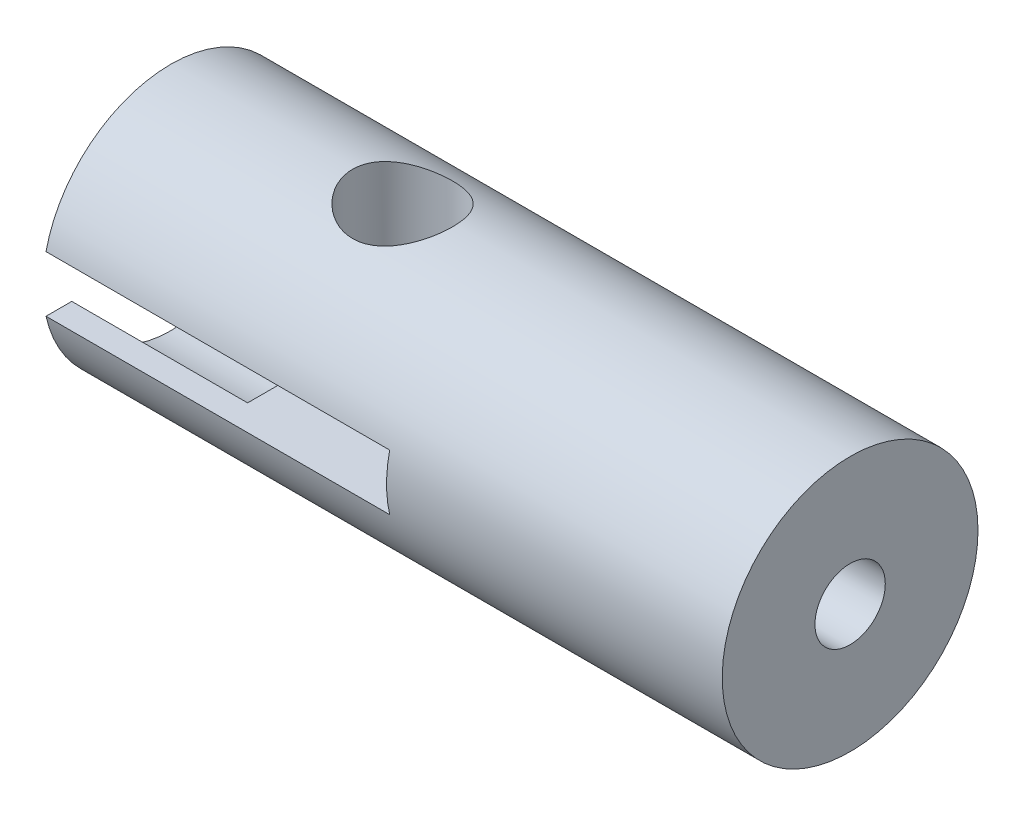
ISO-10303-21;
HEADER;
FILE_DESCRIPTION(('STEP AP214'),'2;1');
FILE_NAME('part.step','',(''),(''),'','','');
FILE_SCHEMA(('AUTOMOTIVE_DESIGN { 1 0 10303 214 1 1 1 1 }'));
ENDSEC;
DATA;
#1=APPLICATION_CONTEXT('core data for automotive mechanical design processes');
#2=APPLICATION_PROTOCOL_DEFINITION('international standard','automotive_design',2000,#1);
#3=PRODUCT_CONTEXT('',#1,'mechanical');
#4=PRODUCT('Part','Part','',(#3));
#5=PRODUCT_RELATED_PRODUCT_CATEGORY('part','',(#4));
#6=PRODUCT_DEFINITION_FORMATION('','',#4);
#7=PRODUCT_DEFINITION_CONTEXT('part definition',#1,'design');
#8=PRODUCT_DEFINITION('design','',#6,#7);
#9=PRODUCT_DEFINITION_SHAPE('','',#8);
#10=(LENGTH_UNIT() NAMED_UNIT(*) SI_UNIT(.MILLI.,.METRE.));
#11=(NAMED_UNIT(*) PLANE_ANGLE_UNIT() SI_UNIT($,.RADIAN.));
#12=(NAMED_UNIT(*) SI_UNIT($,.STERADIAN.) SOLID_ANGLE_UNIT());
#13=UNCERTAINTY_MEASURE_WITH_UNIT(LENGTH_MEASURE(1.E-05),#10,'distance_accuracy_value','');
#14=(GEOMETRIC_REPRESENTATION_CONTEXT(3) GLOBAL_UNCERTAINTY_ASSIGNED_CONTEXT((#13)) GLOBAL_UNIT_ASSIGNED_CONTEXT((#10,
#11,#12)) REPRESENTATION_CONTEXT('',''));
#15=CARTESIAN_POINT('',(0.,0.,0.));
#16=DIRECTION('',(0.,0.,1.));
#17=DIRECTION('',(1.,0.,0.));
#18=AXIS2_PLACEMENT_3D('',#15,#16,#17);
#19=CARTESIAN_POINT('',(-60.5,0.,0.));
#20=DIRECTION('',(-1.,0.,0.));
#21=DIRECTION('',(0.,0.,1.));
#22=AXIS2_PLACEMENT_3D('',#19,#20,#21);
#23=CYLINDRICAL_SURFACE('',#22,12.875);
#24=CARTESIAN_POINT('',(-60.5,0.,0.));
#25=DIRECTION('',(-1.,0.,0.));
#26=DIRECTION('',(0.,0.,1.));
#27=AXIS2_PLACEMENT_3D('',#24,#25,#26);
#28=CIRCLE('',#27,12.875);
#29=CARTESIAN_POINT('',(-60.5,3.5,12.3901422509994));
#30=VERTEX_POINT('',#29);
#31=CARTESIAN_POINT('',(-60.5,3.5,-12.3901422509994));
#32=VERTEX_POINT('',#31);
#33=EDGE_CURVE('E124',#30,#32,#28,.T.);
#34=ORIENTED_EDGE('',*,*,#33,.F.);
#35=DIRECTION('',(-1.,0.,0.));
#36=VECTOR('',#35,1.);
#37=CARTESIAN_POINT('',(-60.5,3.5,12.3901422509994));
#38=LINE('',#37,#36);
#39=CARTESIAN_POINT('',(-82.5,3.5,12.3901422509994));
#40=VERTEX_POINT('',#39);
#41=EDGE_CURVE('E61',#40,#30,#38,.F.);
#42=ORIENTED_EDGE('',*,*,#41,.F.);
#43=CARTESIAN_POINT('',(-82.5,0.,0.));
#44=DIRECTION('',(-1.,0.,0.));
#45=DIRECTION('',(0.,0.,1.));
#46=AXIS2_PLACEMENT_3D('',#43,#44,#45);
#47=CIRCLE('',#46,12.875);
#48=CARTESIAN_POINT('',(-82.5,3.5,-12.3901422509994));
#49=VERTEX_POINT('',#48);
#50=EDGE_CURVE('E128',#40,#49,#47,.T.);
#51=ORIENTED_EDGE('',*,*,#50,.T.);
#52=DIRECTION('',(-1.,0.,0.));
#53=VECTOR('',#52,1.);
#54=CARTESIAN_POINT('',(-60.5,3.5,-12.3901422509994));
#55=LINE('',#54,#53);
#56=EDGE_CURVE('E131',#32,#49,#55,.T.);
#57=ORIENTED_EDGE('',*,*,#56,.F.);
#58=EDGE_LOOP('',(#34,#42,#51,#57));
#59=FACE_BOUND('',#58,.T.);
#60=ADVANCED_FACE('F37',(#59),#23,.F.);
#61=CARTESIAN_POINT('',(-60.5,0.,0.));
#62=DIRECTION('',(-1.,0.,0.));
#63=DIRECTION('',(0.,0.,1.));
#64=AXIS2_PLACEMENT_3D('',#61,#62,#63);
#65=PLANE('',#64);
#66=DIRECTION('',(0.,0.,1.));
#67=VECTOR('',#66,1.);
#68=CARTESIAN_POINT('',(-60.5,3.5,-25.));
#69=LINE('',#68,#67);
#70=EDGE_CURVE('E11',#32,#30,#69,.T.);
#71=ORIENTED_EDGE('',*,*,#70,.T.);
#72=ORIENTED_EDGE('',*,*,#33,.T.);
#73=EDGE_LOOP('',(#71,#72));
#74=FACE_BOUND('',#73,.T.);
#75=ADVANCED_FACE('F212',(#74),#65,.T.);
#76=CARTESIAN_POINT('',(-60.5,-3.5,-12.3901422509994));
#77=VERTEX_POINT('',#76);
#78=CARTESIAN_POINT('',(-60.5,-3.5,12.3901422509994));
#79=VERTEX_POINT('',#78);
#80=EDGE_CURVE('E127',#77,#79,#28,.T.);
#81=ORIENTED_EDGE('',*,*,#80,.F.);
#82=DIRECTION('',(-1.,0.,0.));
#83=VECTOR('',#82,1.);
#84=CARTESIAN_POINT('',(-60.5,-3.5,-12.3901422509994));
#85=LINE('',#84,#83);
#86=CARTESIAN_POINT('',(-82.5,-3.5,-12.3901422509994));
#87=VERTEX_POINT('',#86);
#88=EDGE_CURVE('E53',#87,#77,#85,.F.);
#89=ORIENTED_EDGE('',*,*,#88,.F.);
#90=CARTESIAN_POINT('',(-82.5,-3.5,12.3901422509994));
#91=VERTEX_POINT('',#90);
#92=EDGE_CURVE('E119',#87,#91,#47,.T.);
#93=ORIENTED_EDGE('',*,*,#92,.T.);
#94=DIRECTION('',(-1.,0.,0.));
#95=VECTOR('',#94,1.);
#96=CARTESIAN_POINT('',(-60.5,-3.5,12.3901422509994));
#97=LINE('',#96,#95);
#98=EDGE_CURVE('E135',#79,#91,#97,.T.);
#99=ORIENTED_EDGE('',*,*,#98,.F.);
#100=EDGE_LOOP('',(#81,#89,#93,#99));
#101=FACE_BOUND('',#100,.T.);
#102=ADVANCED_FACE('F209',(#101),#23,.F.);
#103=DIRECTION('',(0.,0.,-1.));
#104=VECTOR('',#103,1.);
#105=CARTESIAN_POINT('',(-60.5,-3.5,-25.));
#106=LINE('',#105,#104);
#107=EDGE_CURVE('E138',#79,#77,#106,.T.);
#108=ORIENTED_EDGE('',*,*,#107,.T.);
#109=ORIENTED_EDGE('',*,*,#80,.T.);
#110=EDGE_LOOP('',(#108,#109));
#111=FACE_BOUND('',#110,.T.);
#112=ADVANCED_FACE('F186',(#111),#65,.T.);
#113=CARTESIAN_POINT('',(-53.5,-16.,0.));
#114=DIRECTION('',(0.,1.,0.));
#115=DIRECTION('',(0.,0.,1.));
#116=AXIS2_PLACEMENT_3D('',#113,#114,#115);
#117=CYLINDRICAL_SURFACE('',#116,6.25);
#118=CARTESIAN_POINT('',(-53.5,3.5,0.));
#119=DIRECTION('',(0.,1.,0.));
#120=DIRECTION('',(0.,0.,1.));
#121=AXIS2_PLACEMENT_3D('',#118,#119,#120);
#122=CIRCLE('',#121,6.25);
#123=CARTESIAN_POINT('',(-53.5,3.5,6.25));
#124=VERTEX_POINT('',#123);
#125=EDGE_CURVE('E159',#124,#124,#122,.F.);
#126=ORIENTED_EDGE('',*,*,#125,.T.);
#127=EDGE_LOOP('',(#126));
#128=FACE_BOUND('',#127,.T.);
#129=CARTESIAN_POINT('',(-53.5,14.7287983216554,6.25));
#130=CARTESIAN_POINT('',(-53.3318745618639,14.7287971924459,6.25000119533584));
#131=CARTESIAN_POINT('',(-53.1637644094569,14.7316846285478,6.24321077356855));
#132=CARTESIAN_POINT('',(-52.8287699924416,14.7431349119434,6.21612360142927));
#133=CARTESIAN_POINT('',(-52.6618861451846,14.7516996084594,6.19582245027452));
#134=CARTESIAN_POINT('',(-52.3307382243454,14.7742137038016,6.14194246405766));
#135=CARTESIAN_POINT('',(-52.1664728822091,14.7881604072821,6.10837027501717));
#136=CARTESIAN_POINT('',(-51.8415707475052,14.8209902546626,6.02827658824581));
#137=CARTESIAN_POINT('',(-51.6809354225531,14.8398753576926,5.98174995083399));
#138=CARTESIAN_POINT('',(-51.3649014489429,14.8819248209711,5.87635251938849));
#139=CARTESIAN_POINT('',(-51.2094884054807,14.905076039161,5.81751956256758));
#140=CARTESIAN_POINT('',(-50.9042729613511,14.9550198745527,5.68789968338292));
#141=CARTESIAN_POINT('',(-50.7544727174836,14.9818138736069,5.61710822219746));
#142=CARTESIAN_POINT('',(-50.4614009820522,15.0382813477027,5.46413191331458));
#143=CARTESIAN_POINT('',(-50.3181288187733,15.0679545254998,5.38194824136649));
#144=CARTESIAN_POINT('',(-50.0388029903374,15.1294022294292,5.20670818975228));
#145=CARTESIAN_POINT('',(-49.9027519687505,15.1611775156838,5.1136478676598));
#146=CARTESIAN_POINT('',(-49.6321380254842,15.2276004759719,4.91242801128222));
#147=CARTESIAN_POINT('',(-49.4979746687822,15.262312604714,4.80375205763725));
#148=CARTESIAN_POINT('',(-49.2391584040224,15.3322125567923,4.57574846976622));
#149=CARTESIAN_POINT('',(-49.1145057548808,15.3674003930483,4.45642054574644));
#150=CARTESIAN_POINT('',(-48.8753798527518,15.4373421212045,4.2077492725668));
#151=CARTESIAN_POINT('',(-48.7609107634521,15.4720958306594,4.07840186687151));
#152=CARTESIAN_POINT('',(-48.5429502906426,15.5402422053392,3.81050740786865));
#153=CARTESIAN_POINT('',(-48.439455119296,15.5736353377242,3.67196355589811));
#154=CARTESIAN_POINT('',(-48.2403856809305,15.6394336156898,3.38100438317759));
#155=CARTESIAN_POINT('',(-48.1452597287548,15.6717534728587,3.22826245706032));
#156=CARTESIAN_POINT('',(-47.9683220901263,15.733088523492,2.91469279196623));
#157=CARTESIAN_POINT('',(-47.8865053537589,15.7621049691093,2.75386815027409));
#158=CARTESIAN_POINT('',(-47.7368738441382,15.8160124685616,2.42517607917603));
#159=CARTESIAN_POINT('',(-47.6690578463735,15.8409038831362,2.25730926722822));
#160=CARTESIAN_POINT('',(-47.548088778838,15.8858298543968,1.91574313465942));
#161=CARTESIAN_POINT('',(-47.4949348204946,15.9058647053994,1.74204416820412));
#162=CARTESIAN_POINT('',(-47.4059698647278,15.9396703581524,1.39833215756739));
#163=CARTESIAN_POINT('',(-47.3694686751664,15.9536886481305,1.22852197047278));
#164=CARTESIAN_POINT('',(-47.3106958548009,15.9763653137595,0.886106600176588));
#165=CARTESIAN_POINT('',(-47.2884234252342,15.9850239902833,0.713501574427272));
#166=CARTESIAN_POINT('',(-47.2583543878455,15.9967324161831,0.366895188844011));
#167=CARTESIAN_POINT('',(-47.2505536258713,15.9997837751605,0.192894244122676));
#168=CARTESIAN_POINT('',(-47.2495033425681,16.0001939715869,-0.155155564748422));
#169=CARTESIAN_POINT('',(-47.2562533374494,15.9975529982969,-0.329204427112618));
#170=CARTESIAN_POINT('',(-47.2834718497347,15.9869502406408,-0.666606217184623));
#171=CARTESIAN_POINT('',(-47.3031818162713,15.9792827313525,-0.830030279377261));
#172=CARTESIAN_POINT('',(-47.3553706163634,15.9591162275498,-1.1545784841537));
#173=CARTESIAN_POINT('',(-47.3878536262772,15.9466156528069,-1.31570185661419));
#174=CARTESIAN_POINT('',(-47.4652690847394,15.9171039649937,-1.6344459582593));
#175=CARTESIAN_POINT('',(-47.5101974672622,15.9000943251573,-1.79206781328725));
#176=CARTESIAN_POINT('',(-47.6121280329063,15.8619766325906,-2.1029095269661));
#177=CARTESIAN_POINT('',(-47.6691347982544,15.8408670246922,-2.25612768984602));
#178=CARTESIAN_POINT('',(-47.7956549780754,15.7947311870257,-2.55936093773527));
#179=CARTESIAN_POINT('',(-47.8653378905597,15.7696525627424,-2.70929726725614));
#180=CARTESIAN_POINT('',(-48.0161219315472,15.7164068237308,-3.00280079887725));
#181=CARTESIAN_POINT('',(-48.0972269466675,15.688238658444,-3.14636581103952));
#182=CARTESIAN_POINT('',(-48.2702748285916,15.6294882466814,-3.42630347184926));
#183=CARTESIAN_POINT('',(-48.3622187339248,15.5989057689709,-3.56267542947841));
#184=CARTESIAN_POINT('',(-48.5563534130119,15.5360454524047,-3.82750808947369));
#185=CARTESIAN_POINT('',(-48.6585447018986,15.5037675283582,-3.95596839359897));
#186=CARTESIAN_POINT('',(-48.8793426252672,15.436199100305,-4.21217281456284));
#187=CARTESIAN_POINT('',(-48.9985784247572,15.4008470940386,-4.3393590913189));
#188=CARTESIAN_POINT('',(-49.2471921944997,15.3300255269734,-4.58327885666985));
#189=CARTESIAN_POINT('',(-49.3765671612275,15.2945560039461,-4.70001541899611));
#190=CARTESIAN_POINT('',(-49.6448347130335,15.2244221583151,-4.92245681845124));
#191=CARTESIAN_POINT('',(-49.783733512758,15.1897583816257,-5.02815433650731));
#192=CARTESIAN_POINT('',(-50.0701274531326,15.1222409435636,-5.22770725137747));
#193=CARTESIAN_POINT('',(-50.21761922714,15.0893865829639,-5.32156724100855));
#194=CARTESIAN_POINT('',(-50.5243956767149,15.0255990986937,-5.49913715656384));
#195=CARTESIAN_POINT('',(-50.6838887964774,14.9947395094755,-5.58251405280771));
#196=CARTESIAN_POINT('',(-51.0099974920596,14.9369300515934,-5.73539906260939));
#197=CARTESIAN_POINT('',(-51.1766101591858,14.9099786056591,-5.80491277542402));
#198=CARTESIAN_POINT('',(-51.515814489309,14.8608998731869,-5.92942975388384));
#199=CARTESIAN_POINT('',(-51.6884044100543,14.8387711943965,-5.98443720820987));
#200=CARTESIAN_POINT('',(-52.0382961407722,14.8001304263756,-6.07937275038553));
#201=CARTESIAN_POINT('',(-52.2155975918656,14.7836179106744,-6.1193019832452));
#202=CARTESIAN_POINT('',(-52.5629172448223,14.7576225255591,-6.18171902842603));
#203=CARTESIAN_POINT('',(-52.7327493648813,14.7477829068698,-6.20509558869646));
#204=CARTESIAN_POINT('',(-53.0739939719087,14.7339718150404,-6.23781960575043));
#205=CARTESIAN_POINT('',(-53.2454063710524,14.7300000177477,-6.24716783749283));
#206=CARTESIAN_POINT('',(-53.5884110138535,14.7280653746149,-6.25172744727001));
#207=CARTESIAN_POINT('',(-53.7600032047611,14.7301010934176,-6.24694220217217));
#208=CARTESIAN_POINT('',(-54.1020372421356,14.7401061290878,-6.22329782230177));
#209=CARTESIAN_POINT('',(-54.272479114832,14.7480753101966,-6.20443900953508));
#210=CARTESIAN_POINT('',(-54.601818271393,14.7690876694987,-6.15424589823815));
#211=CARTESIAN_POINT('',(-54.7608451740568,14.7818364290921,-6.12363338356863));
#212=CARTESIAN_POINT('',(-55.0756753621039,14.812011728143,-6.05027935024995));
#213=CARTESIAN_POINT('',(-55.2314775825362,14.8294397872034,-6.00753389116814));
#214=CARTESIAN_POINT('',(-55.5388003522171,14.8684556909174,-5.91031005379117));
#215=CARTESIAN_POINT('',(-55.6903217491635,14.8900427052912,-5.85583401709418));
#216=CARTESIAN_POINT('',(-55.9882967357882,14.9367819819445,-5.73556490959853));
#217=CARTESIAN_POINT('',(-56.1347483579379,14.9619356095129,-5.6697675029449));
#218=CARTESIAN_POINT('',(-56.4273506365049,15.0161716469541,-5.52456561486722));
#219=CARTESIAN_POINT('',(-56.5732659268083,15.045369167268,-5.44472990345579));
#220=CARTESIAN_POINT('',(-56.8579694376977,15.106094948254,-5.27390861508804));
#221=CARTESIAN_POINT('',(-56.9967551913994,15.1376240065759,-5.18291921524108));
#222=CARTESIAN_POINT('',(-57.2664523500769,15.2021878548894,-4.99037013531658));
#223=CARTESIAN_POINT('',(-57.3973624112562,15.2352229001604,-4.88880865939604));
#224=CARTESIAN_POINT('',(-57.6506150287129,15.3019665722728,-4.67571219247741));
#225=CARTESIAN_POINT('',(-57.7729572707327,15.3356752237631,-4.56417683599034));
#226=CARTESIAN_POINT('',(-58.0166919985611,15.4053051023049,-4.32357877630552));
#227=CARTESIAN_POINT('',(-58.1374168094849,15.4412157993073,-4.19383550178136));
#228=CARTESIAN_POINT('',(-58.3675179615194,15.511874272651,-3.92442878325374));
#229=CARTESIAN_POINT('',(-58.4768979240944,15.546622417684,-3.78476852904577));
#230=CARTESIAN_POINT('',(-58.6836521192253,15.6140383130864,-3.49624945077588));
#231=CARTESIAN_POINT('',(-58.7810209745282,15.6467051285239,-3.34738655122766));
#232=CARTESIAN_POINT('',(-58.9629165970195,15.7090311017528,-3.04149484272905));
#233=CARTESIAN_POINT('',(-59.0474488711937,15.738691547472,-2.88446957452402));
#234=CARTESIAN_POINT('',(-59.2029234607705,15.794162392608,-2.56338527253748));
#235=CARTESIAN_POINT('',(-59.2738804808025,15.8199769510788,-2.39933408772437));
#236=CARTESIAN_POINT('',(-59.4016295940553,15.8670477674099,-2.06524478376215));
#237=CARTESIAN_POINT('',(-59.4584275861816,15.8883059230303,-1.89520919163172));
#238=CARTESIAN_POINT('',(-59.5573055768912,15.9256508175306,-1.55039040229243));
#239=CARTESIAN_POINT('',(-59.5993887055948,15.9417386561724,-1.37560822330446));
#240=CARTESIAN_POINT('',(-59.6683873753096,15.9682649472699,-1.0226557382936));
#241=CARTESIAN_POINT('',(-59.6953038824153,15.9787037595596,-0.844485648823818));
#242=CARTESIAN_POINT('',(-59.7324579590067,15.9931473385698,-0.497476531281476));
#243=CARTESIAN_POINT('',(-59.7436351363931,15.9975143490843,-0.328752546768607));
#244=CARTESIAN_POINT('',(-59.7522770331131,16.0008890634005,0.00909796414324485));
#245=CARTESIAN_POINT('',(-59.749742215438,15.9998969481555,0.178224476757953));
#246=CARTESIAN_POINT('',(-59.7309885781673,15.9925809356187,0.515575824397704));
#247=CARTESIAN_POINT('',(-59.7147715896184,15.9862577517691,0.683800777044563));
#248=CARTESIAN_POINT('',(-59.6688255668578,15.9684520502915,1.01811622037906));
#249=CARTESIAN_POINT('',(-59.6390965660733,15.9569695454272,1.18420671634607));
#250=CARTESIAN_POINT('',(-59.5674625415078,15.929549301449,1.50836410737038));
#251=CARTESIAN_POINT('',(-59.5259285072431,15.913747798885,1.66652478618532));
#252=CARTESIAN_POINT('',(-59.4307501591155,15.8779518211672,1.97872352837782));
#253=CARTESIAN_POINT('',(-59.3771018437411,15.8579559607156,2.13276021069529));
#254=CARTESIAN_POINT('',(-59.25815781595,15.8142600551469,2.4356894889417));
#255=CARTESIAN_POINT('',(-59.1928647010723,15.7905608362625,2.58458322325535));
#256=CARTESIAN_POINT('',(-59.0511243555934,15.7400162266061,2.87643409213728));
#257=CARTESIAN_POINT('',(-58.9746728099124,15.7131696195007,3.01938890246382));
#258=CARTESIAN_POINT('',(-58.7223178762331,15.6263986514768,3.45016170642787));
#259=CARTESIAN_POINT('',(-58.5285051056384,15.562187604106,3.72687823321582));
#260=CARTESIAN_POINT('',(-58.0995830501698,15.4289414756906,4.24494204367573));
#261=CARTESIAN_POINT('',(-57.8644585937094,15.3599046280142,4.48627627337316));
#262=CARTESIAN_POINT('',(-57.4775885705648,15.2558859838681,4.82420735806143));
#263=CARTESIAN_POINT('',(-57.3386293667404,15.2201564967864,4.93549889198648));
#264=CARTESIAN_POINT('',(-57.0514833400066,15.1502858083349,5.14598087060158));
#265=CARTESIAN_POINT('',(-56.9032998925547,15.1161440338658,5.2451757030136));
#266=CARTESIAN_POINT('',(-56.5984645135486,15.0504424549352,5.43082821388527));
#267=CARTESIAN_POINT('',(-56.44180652288,15.0188845395036,5.51727660990129));
#268=CARTESIAN_POINT('',(-56.1211624314763,14.9593846497427,5.6766224614934));
#269=CARTESIAN_POINT('',(-55.9571794048743,14.9314411773514,5.74952553664142));
#270=CARTESIAN_POINT('',(-55.6093547753898,14.8780046125891,5.88649510583645));
#271=CARTESIAN_POINT('',(-55.4249810459574,14.8528938839394,5.94936590462469));
#272=CARTESIAN_POINT('',(-55.0504465508698,14.809010926546,6.057773763884));
#273=CARTESIAN_POINT('',(-54.8602853262457,14.7902392019429,6.10330944573083));
#274=CARTESIAN_POINT('',(-54.4761071918039,14.7598662119154,6.17640024232391));
#275=CARTESIAN_POINT('',(-54.282093109295,14.7482598754698,6.20396807388022));
#276=CARTESIAN_POINT('',(-53.8920455251559,14.7327272441056,6.24076569071656));
#277=CARTESIAN_POINT('',(-53.6960123739957,14.7287996381667,6.24999860639402));
#278=CARTESIAN_POINT('',(-53.5,14.7287983216554,6.25));
#279=B_SPLINE_CURVE_WITH_KNOTS('',3,(#129,#130,#131,#132,#133,#134,#135,#136,#137,#138,#139,
#140,#141,#142,#143,#144,#145,#146,#147,#148,#149,#150,#151,#152,#153,#154,#155,#156,#157,#158,
#159,#160,#161,#162,#163,#164,#165,#166,#167,#168,#169,#170,#171,#172,#173,#174,#175,#176,#177,
#178,#179,#180,#181,#182,#183,#184,#185,#186,#187,#188,#189,#190,#191,#192,#193,#194,#195,#196,
#197,#198,#199,#200,#201,#202,#203,#204,#205,#206,#207,#208,#209,#210,#211,#212,#213,#214,#215,
#216,#217,#218,#219,#220,#221,#222,#223,#224,#225,#226,#227,#228,#229,#230,#231,#232,#233,#234,
#235,#236,#237,#238,#239,#240,#241,#242,#243,#244,#245,#246,#247,#248,#249,#250,#251,#252,#253,
#254,#255,#256,#257,#258,#259,#260,#261,#262,#263,#264,#265,#266,#267,#268,#269,#270,#271,#272,
#273,#274,#275,#276,#277,#278),.UNSPECIFIED.,.T.,.F.,(4,2,2,2,2,2,2,2,2,2,2,2,2,2,2,2,2,2,2,2,2,
2,2,2,2,2,2,2,2,2,2,2,2,2,2,2,2,2,2,2,2,2,2,2,2,2,2,2,2,2,2,2,2,2,2,2,2,2,2,2,2,2,2,2,2,2,2,2,2,
2,2,2,2,2,4),(0.,0.504189167335593,1.00854264213408,1.5126438603822,2.01694536662157,
2.51971854925284,3.02268298876938,3.52559555771888,4.02869098451218,4.55643773347935,
5.08419884451564,5.61217475559931,6.13996782935023,6.68774587986379,7.23531559974783,
7.78283740860761,8.33032602836673,8.85241483337184,9.37447432720051,9.89638393848838,
10.4182761973766,10.9120560809416,11.4059975484582,11.8997778303844,12.393745776309,
12.8948825054371,13.3961901710357,13.8975459085888,14.3989268617837,14.9319795838588,
15.4648749923435,15.9981215059842,16.5311604857906,17.078259389781,17.6251368742779,
18.1718562746182,18.7185341498261,19.2330139353497,19.7474652987166,20.2617937557736,
20.7761104452598,21.2628981781917,21.7498441870769,22.2366930842367,22.7237288513497,
23.2297953501148,23.7360357890815,24.2423623621715,24.7487074970116,25.2905447956503,
25.832208595012,26.3741140185011,26.9157862998527,27.4568684813798,27.9977248601926,
28.5384661188838,29.0791729291541,29.5859914393787,30.0927928367668,30.5995264210907,
31.1062587518139,31.598555587002,32.0910152730041,32.5833652459144,33.0759061225657,
34.1028182340863,35.1301082671334,35.6743075229257,36.2183087956247,36.7627042947284,
37.3068734326919,37.8951628270107,38.4834989969401,39.0714183163785,39.6592372492422),.UNSPECIFIED.);
#280=CARTESIAN_POINT('',(-53.5,14.7287983216554,6.25));
#281=VERTEX_POINT('',#280);
#282=EDGE_CURVE('E172',#281,#281,#279,.T.);
#283=ORIENTED_EDGE('',*,*,#282,.T.);
#284=EDGE_LOOP('',(#283));
#285=FACE_BOUND('',#284,.T.);
#286=ADVANCED_FACE('F181',(#128,#285),#117,.F.);
#287=CARTESIAN_POINT('',(-53.5,-3.5,0.));
#288=DIRECTION('',(0.,-1.,0.));
#289=DIRECTION('',(0.,0.,-1.));
#290=AXIS2_PLACEMENT_3D('',#287,#288,#289);
#291=CIRCLE('',#290,6.25);
#292=CARTESIAN_POINT('',(-53.5,-3.5,-6.25));
#293=VERTEX_POINT('',#292);
#294=EDGE_CURVE('E165',#293,#293,#291,.F.);
#295=ORIENTED_EDGE('',*,*,#294,.T.);
#296=EDGE_LOOP('',(#295));
#297=FACE_BOUND('',#296,.T.);
#298=CARTESIAN_POINT('',(-59.75,-16.,0.));
#299=CARTESIAN_POINT('',(-59.7500011402912,-16.0000008567981,-0.168682361704714));
#300=CARTESIAN_POINT('',(-59.743166068013,-15.9973268978909,-0.337349734733808));
#301=CARTESIAN_POINT('',(-59.7158962512614,-15.98670402183,-0.67347474249481));
#302=CARTESIAN_POINT('',(-59.6954571337482,-15.9787534084906,-0.840931970721271));
#303=CARTESIAN_POINT('',(-59.6412017721261,-15.9577954495059,-1.17322965327253));
#304=CARTESIAN_POINT('',(-59.607393910932,-15.9447912728023,-1.33807168022332));
#305=CARTESIAN_POINT('',(-59.5267194006762,-15.914064730825,-1.66414319313132));
#306=CARTESIAN_POINT('',(-59.4798476665953,-15.8963405284348,-1.82537124591904));
#307=CARTESIAN_POINT('',(-59.373617107862,-15.8566849515961,-2.14267273075115));
#308=CARTESIAN_POINT('',(-59.314289293015,-15.8347640367227,-2.29875787018868));
#309=CARTESIAN_POINT('',(-59.1835598161896,-15.787230431355,-2.60526760557999));
#310=CARTESIAN_POINT('',(-59.1121536731892,-15.7616163712378,-2.7556900752871));
#311=CARTESIAN_POINT('',(-58.9578494445477,-15.7073360905875,-3.04991333655462));
#312=CARTESIAN_POINT('',(-58.8749528513164,-15.6786702665374,-3.19371498481867));
#313=CARTESIAN_POINT('',(-58.6982157666146,-15.6189637434624,-3.47397617344087));
#314=CARTESIAN_POINT('',(-58.6043713160248,-15.5879221866959,-3.61043303143897));
#315=CARTESIAN_POINT('',(-58.4023162821614,-15.5229084374112,-3.8806449179718));
#316=CARTESIAN_POINT('',(-58.2936755359396,-15.4888683336623,-4.01406206082494));
#317=CARTESIAN_POINT('',(-58.0658993595911,-15.4198948610444,-4.271368391186));
#318=CARTESIAN_POINT('',(-57.9467635924764,-15.3849614635179,-4.3952572725085));
#319=CARTESIAN_POINT('',(-57.6986353233266,-15.3150861330088,-4.63286975328979));
#320=CARTESIAN_POINT('',(-57.5696379511698,-15.2801442044149,-4.74658826920724));
#321=CARTESIAN_POINT('',(-57.3026069465513,-15.2112027603739,-4.96308527180852));
#322=CARTESIAN_POINT('',(-57.1645763592932,-15.1772029327792,-5.06586741490281));
#323=CARTESIAN_POINT('',(-56.8741405645786,-15.1096506810095,-5.26401726429575));
#324=CARTESIAN_POINT('',(-56.7213735866527,-15.0761788952809,-5.35888318295788));
#325=CARTESIAN_POINT('',(-56.4078016254066,-15.0123037646134,-5.53529926576874));
#326=CARTESIAN_POINT('',(-56.2469999191548,-14.9818991837062,-5.61685480175279));
#327=CARTESIAN_POINT('',(-55.9183300844192,-14.9251340053366,-5.76599923209406));
#328=CARTESIAN_POINT('',(-55.7504613054129,-14.8987737811981,-5.83358683730784));
#329=CARTESIAN_POINT('',(-55.4089351838513,-14.8510258676346,-5.95409405665459));
#330=CARTESIAN_POINT('',(-55.2352807458784,-14.8296357248328,-6.00702091025134));
#331=CARTESIAN_POINT('',(-54.8910689333721,-14.7933959377517,-6.09570603442683));
#332=CARTESIAN_POINT('',(-54.7207031663164,-14.7783031440627,-6.13210860681532));
#333=CARTESIAN_POINT('',(-54.3771919600167,-14.7539023942814,-6.19058736640007));
#334=CARTESIAN_POINT('',(-54.2040477960341,-14.7445918579269,-6.21266994391517));
#335=CARTESIAN_POINT('',(-53.8563302497486,-14.7320836940855,-6.24227278581645));
#336=CARTESIAN_POINT('',(-53.6817571389248,-14.7288849313334,-6.24979575466111));
#337=CARTESIAN_POINT('',(-53.3325949620174,-14.728715208346,-6.25019600603586));
#338=CARTESIAN_POINT('',(-53.1580058969595,-14.7317439769338,-6.24307392628253));
#339=CARTESIAN_POINT('',(-52.8217574743031,-14.7435126425616,-6.21522649455525));
#340=CARTESIAN_POINT('',(-52.6600063005758,-14.7518617878945,-6.19543146717733));
#341=CARTESIAN_POINT('',(-52.3388218624027,-14.7736303964091,-6.14334121412889));
#342=CARTESIAN_POINT('',(-52.179389381565,-14.7870515341492,-6.11104185996968));
#343=CARTESIAN_POINT('',(-51.8640031518483,-14.8185480664819,-6.03426473513085));
#344=CARTESIAN_POINT('',(-51.7080485473024,-14.8366223022268,-5.98978999653945));
#345=CARTESIAN_POINT('',(-51.4004886366493,-14.8769012660973,-5.88903642514941));
#346=CARTESIAN_POINT('',(-51.2488850244873,-14.8991075784205,-5.83275306398165));
#347=CARTESIAN_POINT('',(-50.948060912036,-14.9474888774359,-5.7076404113532));
#348=CARTESIAN_POINT('',(-50.7989443059621,-14.9737327255907,-5.63858815534904));
#349=CARTESIAN_POINT('',(-50.5069856304376,-15.0291410348631,-5.48919536678093));
#350=CARTESIAN_POINT('',(-50.364145710341,-15.058306485397,-5.40885100634776));
#351=CARTESIAN_POINT('',(-50.0855202024044,-15.1187854330643,-5.23742173794741));
#352=CARTESIAN_POINT('',(-49.9497355107666,-15.1500992019247,-5.14633547025345));
#353=CARTESIAN_POINT('',(-49.6859168596022,-15.2140839092863,-4.95398056392204));
#354=CARTESIAN_POINT('',(-49.5578832816003,-15.2467549144601,-4.85271142471587));
#355=CARTESIAN_POINT('',(-49.3010789977943,-15.3150908671352,-4.63273262203221));
#356=CARTESIAN_POINT('',(-49.172948651155,-15.3507990850451,-4.51328775908606));
#357=CARTESIAN_POINT('',(-48.9271552509465,-15.4218860521875,-4.26406089802361));
#358=CARTESIAN_POINT('',(-48.8094890874393,-15.457264896492,-4.13428199304751));
#359=CARTESIAN_POINT('',(-48.585249047967,-15.5267802797481,-3.86502700963826));
#360=CARTESIAN_POINT('',(-48.4786814062486,-15.560916113551,-3.72554555368576));
#361=CARTESIAN_POINT('',(-48.2774806407879,-15.6270016753522,-3.4378184604398));
#362=CARTESIAN_POINT('',(-48.1828427530778,-15.658952273645,-3.28957635653776));
#363=CARTESIAN_POINT('',(-48.0045218560322,-15.7203893641581,-2.9823393363926));
#364=CARTESIAN_POINT('',(-47.9210747338659,-15.7498191254206,-2.82319592637311));
#365=CARTESIAN_POINT('',(-47.7680040130323,-15.8046883116427,-2.49780589781775));
#366=CARTESIAN_POINT('',(-47.6983748818953,-15.8301293327604,-2.33156215465456));
#367=CARTESIAN_POINT('',(-47.5735782096154,-15.8762909056006,-1.99312462244884));
#368=CARTESIAN_POINT('',(-47.5184080584632,-15.8970123091788,-1.82093191362221));
#369=CARTESIAN_POINT('',(-47.423096380575,-15.9331198802156,-1.47189131379707));
#370=CARTESIAN_POINT('',(-47.3829538676558,-15.9485063977692,-1.29504372908857));
#371=CARTESIAN_POINT('',(-47.3199931907304,-15.9727640627081,-0.948300920329173));
#372=CARTESIAN_POINT('',(-47.2963186659414,-15.981956332428,-0.77858326069398));
#373=CARTESIAN_POINT('',(-47.2629835601866,-15.9949253338804,-0.437574171355054));
#374=CARTESIAN_POINT('',(-47.2533223292817,-15.9987023167746,-0.266282815010505));
#375=CARTESIAN_POINT('',(-47.248118299857,-16.0007349649487,0.0765101777535362));
#376=CARTESIAN_POINT('',(-47.2525725462703,-15.9989917858713,0.248011762647698));
#377=CARTESIAN_POINT('',(-47.2755445360767,-15.9900354502243,0.589924087168196));
#378=CARTESIAN_POINT('',(-47.2940620318813,-15.9828223899539,0.760334845945653));
#379=CARTESIAN_POINT('',(-47.3438733759912,-15.9635489164923,1.09153231422961));
#380=CARTESIAN_POINT('',(-47.3745883172636,-15.9517084822884,1.25241940165114));
#381=CARTESIAN_POINT('',(-47.4484453020027,-15.9234936384489,1.57096327968679));
#382=CARTESIAN_POINT('',(-47.4915914223295,-15.9071177414565,1.72861899235897));
#383=CARTESIAN_POINT('',(-47.5899088932274,-15.8702426702683,2.03958552368116));
#384=CARTESIAN_POINT('',(-47.6450769316975,-15.8497446318635,2.1928975259257));
#385=CARTESIAN_POINT('',(-47.7670114417269,-15.8051080113941,2.49435157562261));
#386=CARTESIAN_POINT('',(-47.8337823220858,-15.7809680459464,2.64249163207158));
#387=CARTESIAN_POINT('',(-47.9805605098192,-15.7288545853145,2.93703317762171));
#388=CARTESIAN_POINT('',(-48.0609031716665,-15.7007882353855,3.08325106994058));
#389=CARTESIAN_POINT('',(-48.2327786630036,-15.6420777576652,3.36847361014225));
#390=CARTESIAN_POINT('',(-48.3243153307811,-15.6114327468123,3.50747576043189));
#391=CARTESIAN_POINT('',(-48.5179673024895,-15.5483044488709,3.77749355310927));
#392=CARTESIAN_POINT('',(-48.6200843120055,-15.5158208657828,3.90850790241374));
#393=CARTESIAN_POINT('',(-48.834270502374,-15.4497946134995,4.1618488425181));
#394=CARTESIAN_POINT('',(-48.9463400899135,-15.4162519010618,4.2841750779321));
#395=CARTESIAN_POINT('',(-49.1871943026264,-15.3467805031369,4.52694841669086));
#396=CARTESIAN_POINT('',(-49.3165877798791,-15.3108350706929,4.64678751433678));
#397=CARTESIAN_POINT('',(-49.5851048613918,-15.2396572669781,4.87515650597019));
#398=CARTESIAN_POINT('',(-49.7242253872423,-15.204424674619,4.98368995113036));
#399=CARTESIAN_POINT('',(-50.0115068319293,-15.1356410209124,5.18884235977635));
#400=CARTESIAN_POINT('',(-50.1596726156572,-15.1020908824399,5.2854548257888));
#401=CARTESIAN_POINT('',(-50.4640387099522,-15.0377010420714,5.46596102271593));
#402=CARTESIAN_POINT('',(-50.6202356037705,-15.006860202414,5.54986010341058));
#403=CARTESIAN_POINT('',(-50.9410287514971,-14.9486041401389,5.70492361433899));
#404=CARTESIAN_POINT('',(-51.1056819235712,-14.9212181105151,5.77598146511195));
#405=CARTESIAN_POINT('',(-51.4410442729731,-14.8710904197564,5.90384526476198));
#406=CARTESIAN_POINT('',(-51.6117508432165,-14.84834678707,5.96065726597469));
#407=CARTESIAN_POINT('',(-51.9579651787682,-14.8083025206509,6.05945720251829));
#408=CARTESIAN_POINT('',(-52.1334711889462,-14.7909999253429,6.1014504808891));
#409=CARTESIAN_POINT('',(-52.4879330012811,-14.7624722569598,6.17015422162763));
#410=CARTESIAN_POINT('',(-52.6668885323155,-14.7512467082469,6.1968658800656));
#411=CARTESIAN_POINT('',(-53.0142805896911,-14.735854911793,6.23337308685887));
#412=CARTESIAN_POINT('',(-53.182589144675,-14.7312543283345,6.24421032638397));
#413=CARTESIAN_POINT('',(-53.5195879602767,-14.7278478048687,6.25224123089662));
#414=CARTESIAN_POINT('',(-53.6882782057868,-14.7290416393901,6.24943542675988));
#415=CARTESIAN_POINT('',(-54.0247197177117,-14.7371825170807,6.23021336481334));
#416=CARTESIAN_POINT('',(-54.1924710857464,-14.7441289250013,6.21379860982052));
#417=CARTESIAN_POINT('',(-54.5257855131504,-14.7635379726605,6.16754195816143));
#418=CARTESIAN_POINT('',(-54.6913485789975,-14.7760005960664,6.13770010125079));
#419=CARTESIAN_POINT('',(-55.0131453295819,-14.8054843735882,6.06622342585104));
#420=CARTESIAN_POINT('',(-55.1694997009504,-14.8223240204364,6.0250550195353));
#421=CARTESIAN_POINT('',(-55.4781286098042,-14.8602498620774,5.93089779534945));
#422=CARTESIAN_POINT('',(-55.6304017933997,-14.8813374467951,5.87790510796293));
#423=CARTESIAN_POINT('',(-55.9299104457769,-14.9271587875872,5.76054634764966));
#424=CARTESIAN_POINT('',(-56.0771466366089,-14.9518920183387,5.6961819130803));
#425=CARTESIAN_POINT('',(-56.3658255252798,-15.0043418226057,5.55655349066806));
#426=CARTESIAN_POINT('',(-56.5072660978961,-15.0320594772144,5.48128554964869));
#427=CARTESIAN_POINT('',(-56.9369976255681,-15.1218160285081,5.23098843474911));
#428=CARTESIAN_POINT('',(-57.214192680284,-15.1878281073969,5.03789381933088));
#429=CARTESIAN_POINT('',(-57.7335296074562,-15.3230927146105,4.61009615149115));
#430=CARTESIAN_POINT('',(-57.9756598260394,-15.3923463101878,4.37537932322927));
#431=CARTESIAN_POINT('',(-58.3152195137324,-15.4955245179959,3.98849288428442));
#432=CARTESIAN_POINT('',(-58.4272483042779,-15.530783131283,3.84924740325045));
#433=CARTESIAN_POINT('',(-58.6391649859605,-15.5993096493934,3.56137493855017));
#434=CARTESIAN_POINT('',(-58.7390573374016,-15.6325782832648,3.41275143213082));
#435=CARTESIAN_POINT('',(-58.9260208243977,-15.696224633592,3.10691940511591));
#436=CARTESIAN_POINT('',(-59.0130832146701,-15.7266003732218,2.94970512794356));
#437=CARTESIAN_POINT('',(-59.1735442392667,-15.783566776343,2.62787196380657));
#438=CARTESIAN_POINT('',(-59.2469485227008,-15.8101590036515,2.46325617330824));
#439=CARTESIAN_POINT('',(-59.3847391333734,-15.8607445553997,2.1143030218592));
#440=CARTESIAN_POINT('',(-59.4479386122595,-15.8843612216027,1.92944008814338));
#441=CARTESIAN_POINT('',(-59.5568915170709,-15.9254791809176,1.5539567548793));
#442=CARTESIAN_POINT('',(-59.6026434274303,-15.9429799427664,1.36333585672254));
#443=CARTESIAN_POINT('',(-59.6760768827694,-15.9712327620459,0.978250692448896));
#444=CARTESIAN_POINT('',(-59.7037678502267,-15.9819883383583,0.783788485007718));
#445=CARTESIAN_POINT('',(-59.7407272337571,-15.9963708737273,0.39287718916225));
#446=CARTESIAN_POINT('',(-59.7499986721457,-15.9999990022696,0.196428432032906));
#447=CARTESIAN_POINT('',(-59.75,-16.,0.));
#448=B_SPLINE_CURVE_WITH_KNOTS('',3,(#298,#299,#300,#301,#302,#303,#304,#305,#306,#307,#308,
#309,#310,#311,#312,#313,#314,#315,#316,#317,#318,#319,#320,#321,#322,#323,#324,#325,#326,#327,
#328,#329,#330,#331,#332,#333,#334,#335,#336,#337,#338,#339,#340,#341,#342,#343,#344,#345,#346,
#347,#348,#349,#350,#351,#352,#353,#354,#355,#356,#357,#358,#359,#360,#361,#362,#363,#364,#365,
#366,#367,#368,#369,#370,#371,#372,#373,#374,#375,#376,#377,#378,#379,#380,#381,#382,#383,#384,
#385,#386,#387,#388,#389,#390,#391,#392,#393,#394,#395,#396,#397,#398,#399,#400,#401,#402,#403,
#404,#405,#406,#407,#408,#409,#410,#411,#412,#413,#414,#415,#416,#417,#418,#419,#420,#421,#422,
#423,#424,#425,#426,#427,#428,#429,#430,#431,#432,#433,#434,#435,#436,#437,#438,#439,#440,#441,
#442,#443,#444,#445,#446,#447),.UNSPECIFIED.,.T.,.F.,(4,2,2,2,2,2,2,2,2,2,2,2,2,2,2,2,2,2,2,2,2,
2,2,2,2,2,2,2,2,2,2,2,2,2,2,2,2,2,2,2,2,2,2,2,2,2,2,2,2,2,2,2,2,2,2,2,2,2,2,2,2,2,2,2,2,2,2,2,2,
2,2,2,2,2,4),(0.,0.505862472856642,1.01188763450923,1.51759599329693,2.02350147101744,
2.52816210646376,3.033010381736,3.53779314732566,4.04275902882245,4.56834574070973,
5.09394933498503,5.61981419483944,6.14550268362685,6.69356624379917,7.24140806529217,
7.78930042624066,8.33692175425001,8.86082523927313,9.38449477041364,9.90806702019716,
10.4316164715832,10.9205582085209,11.4096615146784,11.8986431279699,12.3878125997312,
12.8865076764408,13.3853722135477,13.8842999655943,14.3832522558904,14.9189566003753,
15.454501198593,15.9903450178263,16.5259741734172,17.0715432871192,17.6168935223053,
18.1621452476981,18.7073611848726,19.2215299208011,19.7356748087276,20.2497120678303,
20.7637402773329,21.2558340176357,21.7480893263179,22.2402091871757,22.7325164522137,
23.2395053332901,23.7466685446636,24.2539136399578,24.7611794720956,25.3005233443794,
25.839697291437,26.379163826621,26.9184027206346,27.4619299574036,28.0052258844045,
28.5483257199463,29.091383042033,29.5969015078535,30.1024003031856,30.6078432844429,
31.1132847691699,31.600414747476,32.0877043743242,32.5749238532444,33.0623204226842,
34.0902336582651,35.1184877428143,35.66441426108,36.2101395331957,36.7562350841612,
37.3021042607994,37.8915278482592,38.4810026237607,39.0701696210295,39.6592399385383),.UNSPECIFIED.);
#449=CARTESIAN_POINT('',(-59.75,-16.,0.));
#450=VERTEX_POINT('',#449);
#451=EDGE_CURVE('E177',#450,#450,#448,.T.);
#452=ORIENTED_EDGE('',*,*,#451,.T.);
#453=EDGE_LOOP('',(#452));
#454=FACE_BOUND('',#453,.T.);
#455=ADVANCED_FACE('F185',(#297,#454),#117,.F.);
#456=CARTESIAN_POINT('',(-82.5,0.,0.));
#457=DIRECTION('',(-1.,0.,0.));
#458=DIRECTION('',(0.,0.,1.));
#459=AXIS2_PLACEMENT_3D('',#456,#457,#458);
#460=PLANE('',#459);
#461=ORIENTED_EDGE('',*,*,#92,.F.);
#462=DIRECTION('',(0.,0.,-1.));
#463=VECTOR('',#462,1.);
#464=CARTESIAN_POINT('',(-82.5,-3.5,15.612494995996));
#465=LINE('',#464,#463);
#466=CARTESIAN_POINT('',(-82.5,-3.5,-15.612494995996));
#467=VERTEX_POINT('',#466);
#468=EDGE_CURVE('E150',#87,#467,#465,.T.);
#469=ORIENTED_EDGE('',*,*,#468,.T.);
#470=CARTESIAN_POINT('',(-82.5,0.,0.));
#471=DIRECTION('',(-1.,0.,0.));
#472=DIRECTION('',(0.,0.,1.));
#473=AXIS2_PLACEMENT_3D('',#470,#471,#472);
#474=CIRCLE('',#473,16.);
#475=CARTESIAN_POINT('',(-82.5,-3.5,15.612494995996));
#476=VERTEX_POINT('',#475);
#477=EDGE_CURVE('E147',#467,#476,#474,.T.);
#478=ORIENTED_EDGE('',*,*,#477,.T.);
#479=EDGE_CURVE('E151',#476,#91,#465,.T.);
#480=ORIENTED_EDGE('',*,*,#479,.T.);
#481=EDGE_LOOP('',(#461,#469,#478,#480));
#482=FACE_BOUND('',#481,.T.);
#483=ADVANCED_FACE('F202',(#482),#460,.T.);
#484=CARTESIAN_POINT('',(-82.5,0.,0.));
#485=DIRECTION('',(-1.,0.,0.));
#486=DIRECTION('',(0.,0.,1.));
#487=AXIS2_PLACEMENT_3D('',#484,#485,#486);
#488=PLANE('',#487);
#489=ORIENTED_EDGE('',*,*,#50,.F.);
#490=DIRECTION('',(0.,0.,1.));
#491=VECTOR('',#490,1.);
#492=CARTESIAN_POINT('',(-82.5,3.5,-15.612494995996));
#493=LINE('',#492,#491);
#494=CARTESIAN_POINT('',(-82.5,3.5,15.612494995996));
#495=VERTEX_POINT('',#494);
#496=EDGE_CURVE('E143',#40,#495,#493,.T.);
#497=ORIENTED_EDGE('',*,*,#496,.T.);
#498=CARTESIAN_POINT('',(-82.5,0.,0.));
#499=DIRECTION('',(-1.,0.,0.));
#500=DIRECTION('',(0.,0.,1.));
#501=AXIS2_PLACEMENT_3D('',#498,#499,#500);
#502=CIRCLE('',#501,16.);
#503=CARTESIAN_POINT('',(-82.5,3.5,-15.612494995996));
#504=VERTEX_POINT('',#503);
#505=EDGE_CURVE('E140',#495,#504,#502,.T.);
#506=ORIENTED_EDGE('',*,*,#505,.T.);
#507=EDGE_CURVE('E144',#504,#49,#493,.T.);
#508=ORIENTED_EDGE('',*,*,#507,.T.);
#509=EDGE_LOOP('',(#489,#497,#506,#508));
#510=FACE_BOUND('',#509,.T.);
#511=ADVANCED_FACE('F193',(#510),#488,.T.);
#512=CARTESIAN_POINT('',(-39.5,3.5,-25.));
#513=DIRECTION('',(0.,1.,0.));
#514=DIRECTION('',(0.,0.,1.));
#515=AXIS2_PLACEMENT_3D('',#512,#513,#514);
#516=PLANE('',#515);
#517=ORIENTED_EDGE('',*,*,#70,.F.);
#518=ORIENTED_EDGE('',*,*,#56,.T.);
#519=ORIENTED_EDGE('',*,*,#507,.F.);
#520=DIRECTION('',(-1.,0.,0.));
#521=VECTOR('',#520,1.);
#522=CARTESIAN_POINT('',(-77.5,3.5,-15.612494995996));
#523=LINE('',#522,#521);
#524=CARTESIAN_POINT('',(-39.5,3.5,-15.612494995996));
#525=VERTEX_POINT('',#524);
#526=EDGE_CURVE('E163',#504,#525,#523,.F.);
#527=ORIENTED_EDGE('',*,*,#526,.T.);
#528=DIRECTION('',(0.,0.,-1.));
#529=VECTOR('',#528,1.);
#530=CARTESIAN_POINT('',(-39.5,3.5,-25.));
#531=LINE('',#530,#529);
#532=CARTESIAN_POINT('',(-39.5,3.5,15.612494995996));
#533=VERTEX_POINT('',#532);
#534=EDGE_CURVE('E154',#533,#525,#531,.T.);
#535=ORIENTED_EDGE('',*,*,#534,.F.);
#536=DIRECTION('',(-1.,0.,0.));
#537=VECTOR('',#536,1.);
#538=CARTESIAN_POINT('',(-77.5,3.5,15.612494995996));
#539=LINE('',#538,#537);
#540=EDGE_CURVE('E160',#533,#495,#539,.T.);
#541=ORIENTED_EDGE('',*,*,#540,.T.);
#542=ORIENTED_EDGE('',*,*,#496,.F.);
#543=ORIENTED_EDGE('',*,*,#41,.T.);
#544=EDGE_LOOP('',(#517,#518,#519,#527,#535,#541,#542,#543));
#545=FACE_BOUND('',#544,.T.);
#546=ORIENTED_EDGE('',*,*,#125,.F.);
#547=EDGE_LOOP('',(#546));
#548=FACE_BOUND('',#547,.T.);
#549=ADVANCED_FACE('F188',(#545,#548),#516,.F.);
#550=CARTESIAN_POINT('',(-39.5,0.,0.));
#551=DIRECTION('',(-1.,0.,0.));
#552=DIRECTION('',(0.,0.,1.));
#553=AXIS2_PLACEMENT_3D('',#550,#551,#552);
#554=PLANE('',#553);
#555=DIRECTION('',(0.,0.,1.));
#556=VECTOR('',#555,1.);
#557=CARTESIAN_POINT('',(-39.5,-3.5,-25.));
#558=LINE('',#557,#556);
#559=CARTESIAN_POINT('',(-39.5,-3.5,-15.612494995996));
#560=VERTEX_POINT('',#559);
#561=CARTESIAN_POINT('',(-39.5,-3.5,15.612494995996));
#562=VERTEX_POINT('',#561);
#563=EDGE_CURVE('E157',#560,#562,#558,.T.);
#564=ORIENTED_EDGE('',*,*,#563,.T.);
#565=CARTESIAN_POINT('',(-39.5,0.,0.));
#566=DIRECTION('',(-1.,0.,0.));
#567=DIRECTION('',(0.,0.,1.));
#568=AXIS2_PLACEMENT_3D('',#565,#566,#567);
#569=CIRCLE('',#568,16.);
#570=EDGE_CURVE('E239',#533,#562,#569,.F.);
#571=ORIENTED_EDGE('',*,*,#570,.F.);
#572=ORIENTED_EDGE('',*,*,#534,.T.);
#573=EDGE_CURVE('E46',#560,#525,#569,.F.);
#574=ORIENTED_EDGE('',*,*,#573,.F.);
#575=EDGE_LOOP('',(#564,#571,#572,#574));
#576=FACE_BOUND('',#575,.T.);
#577=ADVANCED_FACE('F192',(#576),#554,.T.);
#578=CARTESIAN_POINT('',(-39.5,-3.5,-25.));
#579=DIRECTION('',(0.,-1.,0.));
#580=DIRECTION('',(0.,0.,-1.));
#581=AXIS2_PLACEMENT_3D('',#578,#579,#580);
#582=PLANE('',#581);
#583=ORIENTED_EDGE('',*,*,#107,.F.);
#584=ORIENTED_EDGE('',*,*,#98,.T.);
#585=ORIENTED_EDGE('',*,*,#479,.F.);
#586=DIRECTION('',(-1.,0.,0.));
#587=VECTOR('',#586,1.);
#588=CARTESIAN_POINT('',(-77.5,-3.5,15.612494995996));
#589=LINE('',#588,#587);
#590=EDGE_CURVE('E169',#476,#562,#589,.F.);
#591=ORIENTED_EDGE('',*,*,#590,.T.);
#592=ORIENTED_EDGE('',*,*,#563,.F.);
#593=DIRECTION('',(-1.,0.,0.));
#594=VECTOR('',#593,1.);
#595=CARTESIAN_POINT('',(-77.5,-3.5,-15.612494995996));
#596=LINE('',#595,#594);
#597=EDGE_CURVE('E166',#560,#467,#596,.T.);
#598=ORIENTED_EDGE('',*,*,#597,.T.);
#599=ORIENTED_EDGE('',*,*,#468,.F.);
#600=ORIENTED_EDGE('',*,*,#88,.T.);
#601=EDGE_LOOP('',(#583,#584,#585,#591,#592,#598,#599,#600));
#602=FACE_BOUND('',#601,.T.);
#603=ORIENTED_EDGE('',*,*,#294,.F.);
#604=EDGE_LOOP('',(#603));
#605=FACE_BOUND('',#604,.T.);
#606=ADVANCED_FACE('F195',(#602,#605),#582,.F.);
#607=CARTESIAN_POINT('',(-77.5,0.,0.));
#608=DIRECTION('',(-1.,0.,0.));
#609=DIRECTION('',(0.,0.,1.));
#610=AXIS2_PLACEMENT_3D('',#607,#608,#609);
#611=CYLINDRICAL_SURFACE('',#610,16.);
#612=ORIENTED_EDGE('',*,*,#597,.F.);
#613=ORIENTED_EDGE('',*,*,#573,.T.);
#614=ORIENTED_EDGE('',*,*,#526,.F.);
#615=ORIENTED_EDGE('',*,*,#505,.F.);
#616=ORIENTED_EDGE('',*,*,#540,.F.);
#617=ORIENTED_EDGE('',*,*,#570,.T.);
#618=ORIENTED_EDGE('',*,*,#590,.F.);
#619=ORIENTED_EDGE('',*,*,#477,.F.);
#620=EDGE_LOOP('',(#612,#613,#614,#615,#616,#617,#618,#619));
#621=FACE_BOUND('',#620,.T.);
#622=ORIENTED_EDGE('',*,*,#451,.F.);
#623=EDGE_LOOP('',(#622));
#624=FACE_BOUND('',#623,.T.);
#625=ORIENTED_EDGE('',*,*,#282,.F.);
#626=EDGE_LOOP('',(#625));
#627=FACE_BOUND('',#626,.T.);
#628=CARTESIAN_POINT('',(2.5,0.,0.));
#629=DIRECTION('',(1.,0.,0.));
#630=DIRECTION('',(0.,0.,-1.));
#631=AXIS2_PLACEMENT_3D('',#628,#629,#630);
#632=CIRCLE('',#631,16.);
#633=CARTESIAN_POINT('',(2.5,0.,-16.));
#634=VERTEX_POINT('',#633);
#635=EDGE_CURVE('E115',#634,#634,#632,.T.);
#636=ORIENTED_EDGE('',*,*,#635,.F.);
#637=EDGE_LOOP('',(#636));
#638=FACE_BOUND('',#637,.T.);
#639=ADVANCED_FACE('F39',(#621,#624,#627,#638),#611,.T.);
#640=CARTESIAN_POINT('',(2.5,0.,0.));
#641=DIRECTION('',(1.,0.,0.));
#642=DIRECTION('',(0.,0.,-1.));
#643=AXIS2_PLACEMENT_3D('',#640,#641,#642);
#644=PLANE('',#643);
#645=CARTESIAN_POINT('',(2.5,0.,0.));
#646=DIRECTION('',(1.,0.,0.));
#647=DIRECTION('',(0.,0.,-1.));
#648=AXIS2_PLACEMENT_3D('',#645,#646,#647);
#649=CIRCLE('',#648,4.39999999999999);
#650=CARTESIAN_POINT('',(2.5,0.,-4.39999999999999));
#651=VERTEX_POINT('',#650);
#652=EDGE_CURVE('E116',#651,#651,#649,.T.);
#653=ORIENTED_EDGE('',*,*,#652,.F.);
#654=EDGE_LOOP('',(#653));
#655=FACE_BOUND('',#654,.T.);
#656=ORIENTED_EDGE('',*,*,#635,.T.);
#657=EDGE_LOOP('',(#656));
#658=FACE_BOUND('',#657,.T.);
#659=ADVANCED_FACE('F109',(#655,#658),#644,.T.);
#660=CARTESIAN_POINT('',(-27.5,0.,0.));
#661=DIRECTION('',(1.,0.,0.));
#662=DIRECTION('',(0.,0.,-1.));
#663=AXIS2_PLACEMENT_3D('',#660,#661,#662);
#664=CONICAL_SURFACE('',#663,4.39999999999999,1.02974425867665);
#665=CARTESIAN_POINT('',(-30.1437867237213,0.,0.));
#666=VERTEX_POINT('',#665);
#667=VERTEX_LOOP('',#666);
#668=FACE_BOUND('',#667,.T.);
#669=CARTESIAN_POINT('',(-27.5,0.,0.));
#670=DIRECTION('',(1.,0.,0.));
#671=DIRECTION('',(0.,0.,-1.));
#672=AXIS2_PLACEMENT_3D('',#669,#670,#671);
#673=CIRCLE('',#672,4.39999999999999);
#674=CARTESIAN_POINT('',(-27.5,0.,-4.39999999999999));
#675=VERTEX_POINT('',#674);
#676=EDGE_CURVE('E113',#675,#675,#673,.T.);
#677=ORIENTED_EDGE('',*,*,#676,.T.);
#678=EDGE_LOOP('',(#677));
#679=FACE_BOUND('',#678,.T.);
#680=ADVANCED_FACE('F105',(#668,#679),#664,.F.);
#681=CARTESIAN_POINT('',(2.5,0.,0.));
#682=DIRECTION('',(1.,0.,0.));
#683=DIRECTION('',(0.,0.,-1.));
#684=AXIS2_PLACEMENT_3D('',#681,#682,#683);
#685=CYLINDRICAL_SURFACE('',#684,4.39999999999999);
#686=ORIENTED_EDGE('',*,*,#676,.F.);
#687=EDGE_LOOP('',(#686));
#688=FACE_BOUND('',#687,.T.);
#689=ORIENTED_EDGE('',*,*,#652,.T.);
#690=EDGE_LOOP('',(#689));
#691=FACE_BOUND('',#690,.T.);
#692=ADVANCED_FACE('F108',(#688,#691),#685,.F.);
#693=CLOSED_SHELL('',(#60,#75,#102,#112,#286,#455,#483,#511,#549,#577,#606,#639,#659,#680,#692));
#694=MANIFOLD_SOLID_BREP('B2',#693);
#695=ADVANCED_BREP_SHAPE_REPRESENTATION('',(#18,#694),#14);
#696=SHAPE_DEFINITION_REPRESENTATION(#9,#695);
ENDSEC;
END-ISO-10303-21;
